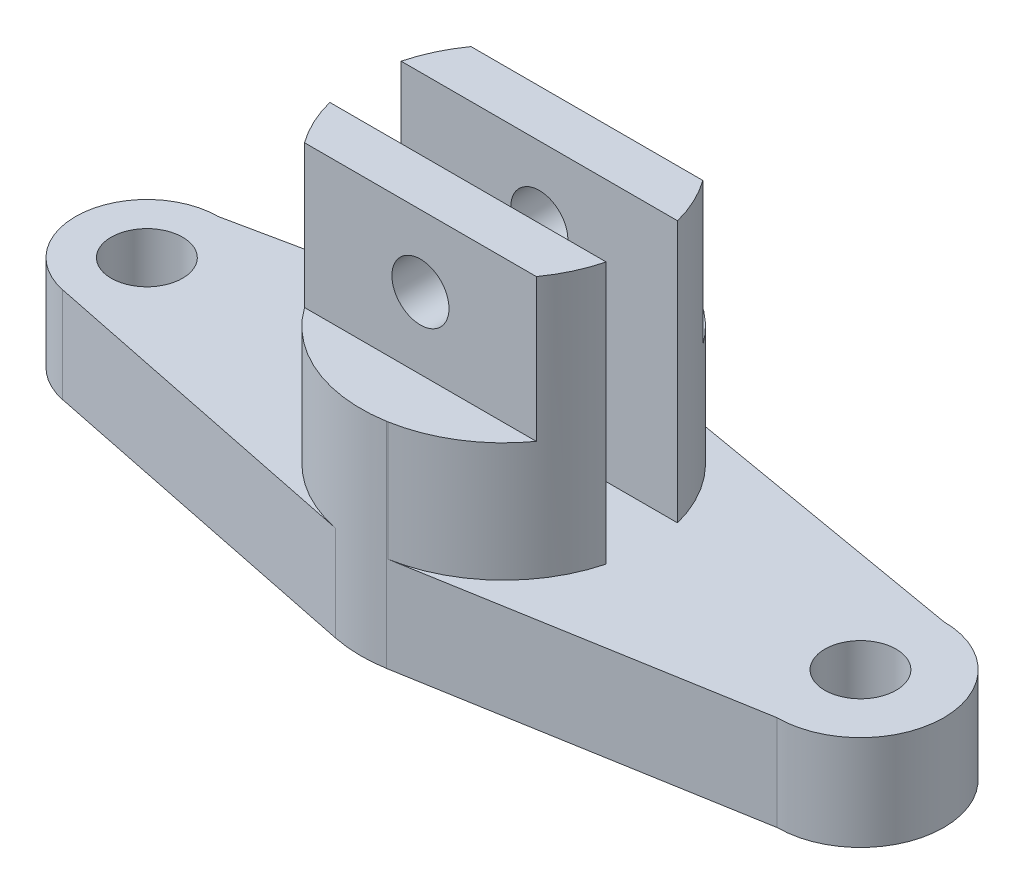
ISO-10303-21;
HEADER;
FILE_DESCRIPTION(('STEP AP214'),'2;1');
FILE_NAME('part.step','',(''),(''),'','','');
FILE_SCHEMA(('AUTOMOTIVE_DESIGN { 1 0 10303 214 1 1 1 1 }'));
ENDSEC;
DATA;
#1=APPLICATION_CONTEXT('core data for automotive mechanical design processes');
#2=APPLICATION_PROTOCOL_DEFINITION('international standard','automotive_design',2000,#1);
#3=PRODUCT_CONTEXT('',#1,'mechanical');
#4=PRODUCT('Part','Part','',(#3));
#5=PRODUCT_RELATED_PRODUCT_CATEGORY('part','',(#4));
#6=PRODUCT_DEFINITION_FORMATION('','',#4);
#7=PRODUCT_DEFINITION_CONTEXT('part definition',#1,'design');
#8=PRODUCT_DEFINITION('design','',#6,#7);
#9=PRODUCT_DEFINITION_SHAPE('','',#8);
#10=(LENGTH_UNIT() NAMED_UNIT(*) SI_UNIT(.MILLI.,.METRE.));
#11=(NAMED_UNIT(*) PLANE_ANGLE_UNIT() SI_UNIT($,.RADIAN.));
#12=(NAMED_UNIT(*) SI_UNIT($,.STERADIAN.) SOLID_ANGLE_UNIT());
#13=UNCERTAINTY_MEASURE_WITH_UNIT(LENGTH_MEASURE(1.E-05),#10,'distance_accuracy_value','');
#14=(GEOMETRIC_REPRESENTATION_CONTEXT(3) GLOBAL_UNCERTAINTY_ASSIGNED_CONTEXT((#13)) GLOBAL_UNIT_ASSIGNED_CONTEXT((#10,
#11,#12)) REPRESENTATION_CONTEXT('',''));
#15=CARTESIAN_POINT('',(0.,0.,0.));
#16=DIRECTION('',(0.,0.,1.));
#17=DIRECTION('',(1.,0.,0.));
#18=AXIS2_PLACEMENT_3D('',#15,#16,#17);
#19=CARTESIAN_POINT('',(0.,45.,0.));
#20=DIRECTION('',(0.,1.,0.));
#21=DIRECTION('',(0.,0.,1.));
#22=AXIS2_PLACEMENT_3D('',#19,#20,#21);
#23=PLANE('',#22);
#24=CARTESIAN_POINT('',(0.,45.,0.));
#25=DIRECTION('',(0.,1.,0.));
#26=DIRECTION('',(0.,0.,1.));
#27=AXIS2_PLACEMENT_3D('',#24,#25,#26);
#28=CIRCLE('',#27,30.);
#29=CARTESIAN_POINT('',(5.22334085747034,45.,29.5417790643468));
#30=VERTEX_POINT('',#29);
#31=CARTESIAN_POINT('',(24.3669858620224,45.,17.5));
#32=VERTEX_POINT('',#31);
#33=EDGE_CURVE('E246',#30,#32,#28,.T.);
#34=ORIENTED_EDGE('',*,*,#33,.T.);
#35=DIRECTION('',(-1.,0.,0.));
#36=VECTOR('',#35,1.);
#37=CARTESIAN_POINT('',(0.,45.,17.5));
#38=LINE('',#37,#36);
#39=CARTESIAN_POINT('',(-24.3669858620224,45.,17.5));
#40=VERTEX_POINT('',#39);
#41=EDGE_CURVE('E229',#32,#40,#38,.T.);
#42=ORIENTED_EDGE('',*,*,#41,.T.);
#43=CARTESIAN_POINT('',(0.,45.,0.));
#44=DIRECTION('',(0.,1.,0.));
#45=DIRECTION('',(0.,0.,1.));
#46=AXIS2_PLACEMENT_3D('',#43,#44,#45);
#47=CIRCLE('',#46,30.);
#48=CARTESIAN_POINT('',(4.9803035051641,45.,29.5837214865955));
#49=VERTEX_POINT('',#48);
#50=EDGE_CURVE('E250',#40,#49,#47,.T.);
#51=ORIENTED_EDGE('',*,*,#50,.T.);
#52=DIRECTION('',(0.985433334257071,0.,-0.170062176085665));
#53=VECTOR('',#52,1.);
#54=CARTESIAN_POINT('',(5.10182218131879,45.,29.5627502754709));
#55=LINE('',#54,#53);
#56=EDGE_CURVE('E254',#49,#30,#55,.T.);
#57=ORIENTED_EDGE('',*,*,#56,.T.);
#58=EDGE_LOOP('',(#34,#42,#51,#57));
#59=FACE_BOUND('',#58,.T.);
#60=ADVANCED_FACE('F47',(#59),#23,.T.);
#61=CARTESIAN_POINT('',(5.10182218131879,20.,-29.5627502754709));
#62=DIRECTION('',(-0.170062176085665,0.,0.985433334257071));
#63=DIRECTION('',(0.985433334257071,0.,0.170062176085665));
#64=AXIS2_PLACEMENT_3D('',#61,#62,#63);
#65=PLANE('',#64);
#66=DIRECTION('',(-0.985433334257071,0.,-0.170062176085665));
#67=VECTOR('',#66,1.);
#68=CARTESIAN_POINT('',(5.10182218131879,0.,-29.5627502754709));
#69=LINE('',#68,#67);
#70=CARTESIAN_POINT('',(75.,0.,-17.5));
#71=VERTEX_POINT('',#70);
#72=CARTESIAN_POINT('',(4.9803035051641,0.,-29.5837214865955));
#73=VERTEX_POINT('',#72);
#74=EDGE_CURVE('E280',#71,#73,#69,.T.);
#75=ORIENTED_EDGE('',*,*,#74,.T.);
#76=DIRECTION('',(0.,-1.,0.));
#77=VECTOR('',#76,1.);
#78=CARTESIAN_POINT('',(4.9803035051641,20.,-29.5837214865955));
#79=LINE('',#78,#77);
#80=CARTESIAN_POINT('',(4.98030350516411,45.,-29.5837214865955));
#81=VERTEX_POINT('',#80);
#82=EDGE_CURVE('E57',#81,#73,#79,.T.);
#83=ORIENTED_EDGE('',*,*,#82,.F.);
#84=DIRECTION('',(0.985433334257071,0.,0.170062176085665));
#85=VECTOR('',#84,1.);
#86=CARTESIAN_POINT('',(5.10182218131879,45.,-29.5627502754709));
#87=LINE('',#86,#85);
#88=CARTESIAN_POINT('',(5.22334085747207,45.,-29.5417790643465));
#89=VERTEX_POINT('',#88);
#90=EDGE_CURVE('E281',#81,#89,#87,.T.);
#91=ORIENTED_EDGE('',*,*,#90,.T.);
#92=DIRECTION('',(0.,-1.,0.));
#93=VECTOR('',#92,1.);
#94=CARTESIAN_POINT('',(5.22334085747207,45.,-29.5417790643465));
#95=LINE('',#94,#93);
#96=CARTESIAN_POINT('',(5.22334085747207,20.,-29.5417790643465));
#97=VERTEX_POINT('',#96);
#98=EDGE_CURVE('E189',#89,#97,#95,.T.);
#99=ORIENTED_EDGE('',*,*,#98,.T.);
#100=DIRECTION('',(-0.985433334257071,0.,-0.170062176085665));
#101=VECTOR('',#100,1.);
#102=CARTESIAN_POINT('',(5.10182218131879,20.,-29.5627502754709));
#103=LINE('',#102,#101);
#104=CARTESIAN_POINT('',(75.,20.,-17.5));
#105=VERTEX_POINT('',#104);
#106=EDGE_CURVE('E300',#105,#97,#103,.T.);
#107=ORIENTED_EDGE('',*,*,#106,.F.);
#108=DIRECTION('',(0.,-1.,0.));
#109=VECTOR('',#108,1.);
#110=CARTESIAN_POINT('',(75.,20.,-17.5));
#111=LINE('',#110,#109);
#112=EDGE_CURVE('E329',#105,#71,#111,.T.);
#113=ORIENTED_EDGE('',*,*,#112,.T.);
#114=EDGE_LOOP('',(#75,#83,#91,#99,#107,#113));
#115=FACE_BOUND('',#114,.T.);
#116=ADVANCED_FACE('F49',(#115),#65,.F.);
#117=CARTESIAN_POINT('',(0.,20.,0.));
#118=DIRECTION('',(0.,-1.,0.));
#119=DIRECTION('',(0.,0.,-1.));
#120=AXIS2_PLACEMENT_3D('',#117,#118,#119);
#121=CYLINDRICAL_SURFACE('',#120,30.);
#122=CARTESIAN_POINT('',(0.,0.,0.));
#123=DIRECTION('',(0.,1.,0.));
#124=DIRECTION('',(0.,0.,1.));
#125=AXIS2_PLACEMENT_3D('',#122,#123,#124);
#126=CIRCLE('',#125,30.);
#127=CARTESIAN_POINT('',(-6.12645394064298,0.,-29.3677810212685));
#128=VERTEX_POINT('',#127);
#129=EDGE_CURVE('E333',#73,#128,#126,.T.);
#130=ORIENTED_EDGE('',*,*,#129,.T.);
#131=DIRECTION('',(0.,-1.,0.));
#132=VECTOR('',#131,1.);
#133=CARTESIAN_POINT('',(-6.12645394064298,20.,-29.3677810212685));
#134=LINE('',#133,#132);
#135=CARTESIAN_POINT('',(-6.12645394064298,20.,-29.3677810212685));
#136=VERTEX_POINT('',#135);
#137=EDGE_CURVE('E385',#136,#128,#134,.T.);
#138=ORIENTED_EDGE('',*,*,#137,.F.);
#139=CARTESIAN_POINT('',(0.,20.,0.));
#140=DIRECTION('',(0.,1.,0.));
#141=DIRECTION('',(0.,0.,1.));
#142=AXIS2_PLACEMENT_3D('',#139,#140,#141);
#143=CIRCLE('',#142,30.);
#144=CARTESIAN_POINT('',(-29.0473750965556,20.,-7.50000000000001));
#145=VERTEX_POINT('',#144);
#146=EDGE_CURVE('E11',#136,#145,#143,.T.);
#147=ORIENTED_EDGE('',*,*,#146,.T.);
#148=DIRECTION('',(0.,-1.,0.));
#149=VECTOR('',#148,1.);
#150=CARTESIAN_POINT('',(-29.0473750965556,45.,-7.50000000000001));
#151=LINE('',#150,#149);
#152=CARTESIAN_POINT('',(-29.0473750965556,75.,-7.50000000000001));
#153=VERTEX_POINT('',#152);
#154=EDGE_CURVE('E188',#153,#145,#151,.T.);
#155=ORIENTED_EDGE('',*,*,#154,.F.);
#156=CARTESIAN_POINT('',(0.,75.,0.));
#157=DIRECTION('',(0.,1.,0.));
#158=DIRECTION('',(0.,0.,1.));
#159=AXIS2_PLACEMENT_3D('',#156,#157,#158);
#160=CIRCLE('',#159,30.);
#161=CARTESIAN_POINT('',(-24.3669858620224,75.,-17.5));
#162=VERTEX_POINT('',#161);
#163=EDGE_CURVE('E204',#162,#153,#160,.T.);
#164=ORIENTED_EDGE('',*,*,#163,.F.);
#165=DIRECTION('',(0.,-1.,0.));
#166=VECTOR('',#165,1.);
#167=CARTESIAN_POINT('',(-24.3669858620224,75.,-17.5));
#168=LINE('',#167,#166);
#169=CARTESIAN_POINT('',(-24.3669858620224,45.,-17.5));
#170=VERTEX_POINT('',#169);
#171=EDGE_CURVE('E217',#162,#170,#168,.T.);
#172=ORIENTED_EDGE('',*,*,#171,.T.);
#173=CARTESIAN_POINT('',(0.,45.,0.));
#174=DIRECTION('',(0.,1.,0.));
#175=DIRECTION('',(0.,0.,1.));
#176=AXIS2_PLACEMENT_3D('',#173,#174,#175);
#177=CIRCLE('',#176,30.);
#178=EDGE_CURVE('E288',#81,#170,#177,.T.);
#179=ORIENTED_EDGE('',*,*,#178,.F.);
#180=ORIENTED_EDGE('',*,*,#82,.T.);
#181=EDGE_LOOP('',(#130,#138,#147,#155,#164,#172,#179,#180));
#182=FACE_BOUND('',#181,.T.);
#183=ADVANCED_FACE('F391',(#182),#121,.T.);
#184=CARTESIAN_POINT('',(-6.12644335404868,20.,-29.3677832297488));
#185=DIRECTION('',(-0.204214778468303,0.,-0.978926107658358));
#186=DIRECTION('',(-0.978926107658358,0.,0.204214778468303));
#187=AXIS2_PLACEMENT_3D('',#184,#185,#186);
#188=PLANE('',#187);
#189=DIRECTION('',(0.978926107658358,0.,-0.204214778468303));
#190=VECTOR('',#189,1.);
#191=CARTESIAN_POINT('',(-6.12644335404868,0.,-29.3677832297488));
#192=LINE('',#191,#190);
#193=CARTESIAN_POINT('',(-75.,0.,-15.));
#194=VERTEX_POINT('',#193);
#195=EDGE_CURVE('E337',#194,#128,#192,.T.);
#196=ORIENTED_EDGE('',*,*,#195,.F.);
#197=DIRECTION('',(0.,-1.,0.));
#198=VECTOR('',#197,1.);
#199=CARTESIAN_POINT('',(-75.,20.,-15.));
#200=LINE('',#199,#198);
#201=CARTESIAN_POINT('',(-75.,20.,-15.));
#202=VERTEX_POINT('',#201);
#203=EDGE_CURVE('E382',#202,#194,#200,.T.);
#204=ORIENTED_EDGE('',*,*,#203,.F.);
#205=DIRECTION('',(0.978926107658358,0.,-0.204214778468303));
#206=VECTOR('',#205,1.);
#207=CARTESIAN_POINT('',(-6.12644335404868,20.,-29.3677832297488));
#208=LINE('',#207,#206);
#209=EDGE_CURVE('E303',#202,#136,#208,.T.);
#210=ORIENTED_EDGE('',*,*,#209,.T.);
#211=ORIENTED_EDGE('',*,*,#137,.T.);
#212=EDGE_LOOP('',(#196,#204,#210,#211));
#213=FACE_BOUND('',#212,.T.);
#214=ADVANCED_FACE('F407',(#213),#188,.T.);
#215=CARTESIAN_POINT('',(-75.,20.,0.));
#216=DIRECTION('',(0.,-1.,0.));
#217=DIRECTION('',(0.,0.,-1.));
#218=AXIS2_PLACEMENT_3D('',#215,#216,#217);
#219=CYLINDRICAL_SURFACE('',#218,15.);
#220=CARTESIAN_POINT('',(-75.,0.,0.));
#221=DIRECTION('',(0.,1.,0.));
#222=DIRECTION('',(0.,0.,1.));
#223=AXIS2_PLACEMENT_3D('',#220,#221,#222);
#224=CIRCLE('',#223,15.);
#225=CARTESIAN_POINT('',(-78.,0.,14.6969384566991));
#226=VERTEX_POINT('',#225);
#227=EDGE_CURVE('E341',#194,#226,#224,.T.);
#228=ORIENTED_EDGE('',*,*,#227,.T.);
#229=DIRECTION('',(0.,-1.,0.));
#230=VECTOR('',#229,1.);
#231=CARTESIAN_POINT('',(-78.,20.,14.6969384566991));
#232=LINE('',#231,#230);
#233=CARTESIAN_POINT('',(-78.,20.,14.6969384566991));
#234=VERTEX_POINT('',#233);
#235=EDGE_CURVE('E378',#234,#226,#232,.T.);
#236=ORIENTED_EDGE('',*,*,#235,.F.);
#237=CARTESIAN_POINT('',(-75.,20.,0.));
#238=DIRECTION('',(0.,1.,0.));
#239=DIRECTION('',(0.,0.,1.));
#240=AXIS2_PLACEMENT_3D('',#237,#238,#239);
#241=CIRCLE('',#240,15.);
#242=EDGE_CURVE('E308',#202,#234,#241,.T.);
#243=ORIENTED_EDGE('',*,*,#242,.F.);
#244=ORIENTED_EDGE('',*,*,#203,.T.);
#245=EDGE_LOOP('',(#228,#236,#243,#244));
#246=FACE_BOUND('',#245,.T.);
#247=ADVANCED_FACE('F485',(#246),#219,.T.);
#248=CARTESIAN_POINT('',(-5.99999999999999,20.,29.3938769133981));
#249=DIRECTION('',(0.2,0.,-0.979795897113271));
#250=DIRECTION('',(-0.979795897113271,0.,-0.2));
#251=AXIS2_PLACEMENT_3D('',#248,#249,#250);
#252=PLANE('',#251);
#253=DIRECTION('',(0.979795897113271,0.,0.2));
#254=VECTOR('',#253,1.);
#255=CARTESIAN_POINT('',(-5.99999999999999,0.,29.3938769133981));
#256=LINE('',#255,#254);
#257=CARTESIAN_POINT('',(-6.,0.,29.3938769133981));
#258=VERTEX_POINT('',#257);
#259=EDGE_CURVE('E344',#226,#258,#256,.T.);
#260=ORIENTED_EDGE('',*,*,#259,.T.);
#261=DIRECTION('',(0.,-1.,0.));
#262=VECTOR('',#261,1.);
#263=CARTESIAN_POINT('',(-6.,20.,29.3938769133981));
#264=LINE('',#263,#262);
#265=CARTESIAN_POINT('',(-6.,20.,29.3938769133981));
#266=VERTEX_POINT('',#265);
#267=EDGE_CURVE('E374',#266,#258,#264,.T.);
#268=ORIENTED_EDGE('',*,*,#267,.F.);
#269=DIRECTION('',(0.979795897113271,0.,0.2));
#270=VECTOR('',#269,1.);
#271=CARTESIAN_POINT('',(-5.99999999999999,20.,29.3938769133981));
#272=LINE('',#271,#270);
#273=EDGE_CURVE('E311',#234,#266,#272,.T.);
#274=ORIENTED_EDGE('',*,*,#273,.F.);
#275=ORIENTED_EDGE('',*,*,#235,.T.);
#276=EDGE_LOOP('',(#260,#268,#274,#275));
#277=FACE_BOUND('',#276,.T.);
#278=ADVANCED_FACE('F481',(#277),#252,.F.);
#279=CARTESIAN_POINT('',(0.,20.,0.));
#280=DIRECTION('',(0.,-1.,0.));
#281=DIRECTION('',(0.,0.,-1.));
#282=AXIS2_PLACEMENT_3D('',#279,#280,#281);
#283=CYLINDRICAL_SURFACE('',#282,30.);
#284=CARTESIAN_POINT('',(0.,0.,0.));
#285=DIRECTION('',(0.,1.,0.));
#286=DIRECTION('',(0.,0.,1.));
#287=AXIS2_PLACEMENT_3D('',#284,#285,#286);
#288=CIRCLE('',#287,30.);
#289=CARTESIAN_POINT('',(4.9803035051641,0.,29.5837214865955));
#290=VERTEX_POINT('',#289);
#291=EDGE_CURVE('E347',#258,#290,#288,.T.);
#292=ORIENTED_EDGE('',*,*,#291,.T.);
#293=DIRECTION('',(0.,-1.,0.));
#294=VECTOR('',#293,1.);
#295=CARTESIAN_POINT('',(4.9803035051641,20.,29.5837214865955));
#296=LINE('',#295,#294);
#297=EDGE_CURVE('E371',#49,#290,#296,.T.);
#298=ORIENTED_EDGE('',*,*,#297,.F.);
#299=ORIENTED_EDGE('',*,*,#50,.F.);
#300=DIRECTION('',(0.,-1.,0.));
#301=VECTOR('',#300,1.);
#302=CARTESIAN_POINT('',(-24.3669858620224,75.,17.5));
#303=LINE('',#302,#301);
#304=CARTESIAN_POINT('',(-24.3669858620224,75.,17.5));
#305=VERTEX_POINT('',#304);
#306=EDGE_CURVE('E73',#305,#40,#303,.T.);
#307=ORIENTED_EDGE('',*,*,#306,.F.);
#308=CARTESIAN_POINT('',(0.,75.,0.));
#309=DIRECTION('',(0.,1.,0.));
#310=DIRECTION('',(0.,0.,1.));
#311=AXIS2_PLACEMENT_3D('',#308,#309,#310);
#312=CIRCLE('',#311,30.);
#313=CARTESIAN_POINT('',(-29.0473750965556,75.,7.5));
#314=VERTEX_POINT('',#313);
#315=EDGE_CURVE('E228',#314,#305,#312,.T.);
#316=ORIENTED_EDGE('',*,*,#315,.F.);
#317=DIRECTION('',(0.,-1.,0.));
#318=VECTOR('',#317,1.);
#319=CARTESIAN_POINT('',(-29.0473750965556,45.,7.5));
#320=LINE('',#319,#318);
#321=CARTESIAN_POINT('',(-29.0473750965556,20.,7.5));
#322=VERTEX_POINT('',#321);
#323=EDGE_CURVE('E272',#314,#322,#320,.T.);
#324=ORIENTED_EDGE('',*,*,#323,.T.);
#325=CARTESIAN_POINT('',(0.,20.,0.));
#326=DIRECTION('',(0.,1.,0.));
#327=DIRECTION('',(0.,0.,1.));
#328=AXIS2_PLACEMENT_3D('',#325,#326,#327);
#329=CIRCLE('',#328,30.);
#330=EDGE_CURVE('E251',#322,#266,#329,.T.);
#331=ORIENTED_EDGE('',*,*,#330,.T.);
#332=ORIENTED_EDGE('',*,*,#267,.T.);
#333=EDGE_LOOP('',(#292,#298,#299,#307,#316,#324,#331,#332));
#334=FACE_BOUND('',#333,.T.);
#335=ADVANCED_FACE('F477',(#334),#283,.T.);
#336=CARTESIAN_POINT('',(5.10182218131879,20.,29.5627502754709));
#337=DIRECTION('',(0.170062176085665,0.,0.985433334257071));
#338=DIRECTION('',(0.985433334257071,0.,-0.170062176085665));
#339=AXIS2_PLACEMENT_3D('',#336,#337,#338);
#340=PLANE('',#339);
#341=DIRECTION('',(-0.985433334257071,0.,0.170062176085665));
#342=VECTOR('',#341,1.);
#343=CARTESIAN_POINT('',(5.10182218131879,0.,29.5627502754709));
#344=LINE('',#343,#342);
#345=CARTESIAN_POINT('',(75.,0.,17.5));
#346=VERTEX_POINT('',#345);
#347=EDGE_CURVE('E351',#346,#290,#344,.T.);
#348=ORIENTED_EDGE('',*,*,#347,.F.);
#349=DIRECTION('',(0.,-1.,0.));
#350=VECTOR('',#349,1.);
#351=CARTESIAN_POINT('',(75.,20.,17.5));
#352=LINE('',#351,#350);
#353=CARTESIAN_POINT('',(75.,20.,17.5));
#354=VERTEX_POINT('',#353);
#355=EDGE_CURVE('E368',#354,#346,#352,.T.);
#356=ORIENTED_EDGE('',*,*,#355,.F.);
#357=DIRECTION('',(-0.985433334257071,0.,0.170062176085665));
#358=VECTOR('',#357,1.);
#359=CARTESIAN_POINT('',(5.10182218131879,20.,29.5627502754709));
#360=LINE('',#359,#358);
#361=CARTESIAN_POINT('',(5.22334085747034,20.,29.5417790643468));
#362=VERTEX_POINT('',#361);
#363=EDGE_CURVE('E314',#354,#362,#360,.T.);
#364=ORIENTED_EDGE('',*,*,#363,.T.);
#365=DIRECTION('',(0.,-1.,0.));
#366=VECTOR('',#365,1.);
#367=CARTESIAN_POINT('',(5.22334085747034,45.,29.5417790643468));
#368=LINE('',#367,#366);
#369=EDGE_CURVE('E257',#30,#362,#368,.T.);
#370=ORIENTED_EDGE('',*,*,#369,.F.);
#371=ORIENTED_EDGE('',*,*,#56,.F.);
#372=ORIENTED_EDGE('',*,*,#297,.T.);
#373=EDGE_LOOP('',(#348,#356,#364,#370,#371,#372));
#374=FACE_BOUND('',#373,.T.);
#375=ADVANCED_FACE('F470',(#374),#340,.T.);
#376=CARTESIAN_POINT('',(-75.,20.,0.));
#377=DIRECTION('',(0.,-1.,0.));
#378=DIRECTION('',(0.,0.,-1.));
#379=AXIS2_PLACEMENT_3D('',#376,#377,#378);
#380=CYLINDRICAL_SURFACE('',#379,7.5);
#381=CARTESIAN_POINT('',(-75.,20.,0.));
#382=DIRECTION('',(0.,1.,0.));
#383=DIRECTION('',(0.,0.,1.));
#384=AXIS2_PLACEMENT_3D('',#381,#382,#383);
#385=CIRCLE('',#384,7.5);
#386=CARTESIAN_POINT('',(-75.,20.,7.50000000000001));
#387=VERTEX_POINT('',#386);
#388=EDGE_CURVE('E321',#387,#387,#385,.T.);
#389=ORIENTED_EDGE('',*,*,#388,.T.);
#390=EDGE_LOOP('',(#389));
#391=FACE_BOUND('',#390,.T.);
#392=CARTESIAN_POINT('',(-75.,0.,0.));
#393=DIRECTION('',(0.,1.,0.));
#394=DIRECTION('',(0.,0.,1.));
#395=AXIS2_PLACEMENT_3D('',#392,#393,#394);
#396=CIRCLE('',#395,7.5);
#397=CARTESIAN_POINT('',(-75.,0.,7.50000000000001));
#398=VERTEX_POINT('',#397);
#399=EDGE_CURVE('E358',#398,#398,#396,.T.);
#400=ORIENTED_EDGE('',*,*,#399,.F.);
#401=EDGE_LOOP('',(#400));
#402=FACE_BOUND('',#401,.T.);
#403=ADVANCED_FACE('F467',(#391,#402),#380,.F.);
#404=CARTESIAN_POINT('',(75.,20.,0.));
#405=DIRECTION('',(0.,-1.,0.));
#406=DIRECTION('',(0.,0.,-1.));
#407=AXIS2_PLACEMENT_3D('',#404,#405,#406);
#408=CYLINDRICAL_SURFACE('',#407,17.5);
#409=CARTESIAN_POINT('',(75.,0.,0.));
#410=DIRECTION('',(0.,1.,0.));
#411=DIRECTION('',(0.,0.,1.));
#412=AXIS2_PLACEMENT_3D('',#409,#410,#411);
#413=CIRCLE('',#412,17.5);
#414=EDGE_CURVE('E355',#346,#71,#413,.T.);
#415=ORIENTED_EDGE('',*,*,#414,.T.);
#416=ORIENTED_EDGE('',*,*,#112,.F.);
#417=CARTESIAN_POINT('',(75.,20.,0.));
#418=DIRECTION('',(0.,1.,0.));
#419=DIRECTION('',(0.,0.,1.));
#420=AXIS2_PLACEMENT_3D('',#417,#418,#419);
#421=CIRCLE('',#420,17.5);
#422=EDGE_CURVE('E318',#354,#105,#421,.T.);
#423=ORIENTED_EDGE('',*,*,#422,.F.);
#424=ORIENTED_EDGE('',*,*,#355,.T.);
#425=EDGE_LOOP('',(#415,#416,#423,#424));
#426=FACE_BOUND('',#425,.T.);
#427=ADVANCED_FACE('F465',(#426),#408,.T.);
#428=CARTESIAN_POINT('',(75.,20.,0.));
#429=DIRECTION('',(0.,-1.,0.));
#430=DIRECTION('',(0.,0.,-1.));
#431=AXIS2_PLACEMENT_3D('',#428,#429,#430);
#432=CYLINDRICAL_SURFACE('',#431,7.5);
#433=CARTESIAN_POINT('',(75.,20.,0.));
#434=DIRECTION('',(0.,1.,0.));
#435=DIRECTION('',(0.,0.,1.));
#436=AXIS2_PLACEMENT_3D('',#433,#434,#435);
#437=CIRCLE('',#436,7.5);
#438=CARTESIAN_POINT('',(75.,20.,7.5));
#439=VERTEX_POINT('',#438);
#440=EDGE_CURVE('E325',#439,#439,#437,.T.);
#441=ORIENTED_EDGE('',*,*,#440,.T.);
#442=EDGE_LOOP('',(#441));
#443=FACE_BOUND('',#442,.T.);
#444=CARTESIAN_POINT('',(75.,0.,0.));
#445=DIRECTION('',(0.,1.,0.));
#446=DIRECTION('',(0.,0.,1.));
#447=AXIS2_PLACEMENT_3D('',#444,#445,#446);
#448=CIRCLE('',#447,7.5);
#449=CARTESIAN_POINT('',(75.,0.,7.5));
#450=VERTEX_POINT('',#449);
#451=EDGE_CURVE('E304',#450,#450,#448,.T.);
#452=ORIENTED_EDGE('',*,*,#451,.F.);
#453=EDGE_LOOP('',(#452));
#454=FACE_BOUND('',#453,.T.);
#455=ADVANCED_FACE('F460',(#443,#454),#432,.F.);
#456=CARTESIAN_POINT('',(0.,20.,0.));
#457=DIRECTION('',(0.,1.,0.));
#458=DIRECTION('',(0.,0.,1.));
#459=AXIS2_PLACEMENT_3D('',#456,#457,#458);
#460=PLANE('',#459);
#461=CARTESIAN_POINT('',(0.,20.,0.));
#462=DIRECTION('',(0.,1.,0.));
#463=DIRECTION('',(0.,0.,1.));
#464=AXIS2_PLACEMENT_3D('',#461,#462,#463);
#465=CIRCLE('',#464,30.);
#466=CARTESIAN_POINT('',(29.0473750965556,20.,7.49999999999999));
#467=VERTEX_POINT('',#466);
#468=EDGE_CURVE('E258',#362,#467,#465,.T.);
#469=ORIENTED_EDGE('',*,*,#468,.F.);
#470=ORIENTED_EDGE('',*,*,#363,.F.);
#471=ORIENTED_EDGE('',*,*,#422,.T.);
#472=ORIENTED_EDGE('',*,*,#106,.T.);
#473=CARTESIAN_POINT('',(0.,20.,0.));
#474=DIRECTION('',(0.,1.,0.));
#475=DIRECTION('',(0.,0.,1.));
#476=AXIS2_PLACEMENT_3D('',#473,#474,#475);
#477=CIRCLE('',#476,30.);
#478=CARTESIAN_POINT('',(29.0473750965556,20.,-7.5));
#479=VERTEX_POINT('',#478);
#480=EDGE_CURVE('E224',#479,#97,#477,.T.);
#481=ORIENTED_EDGE('',*,*,#480,.F.);
#482=DIRECTION('',(1.,0.,0.));
#483=VECTOR('',#482,1.);
#484=CARTESIAN_POINT('',(0.,20.,-7.5));
#485=LINE('',#484,#483);
#486=EDGE_CURVE('E184',#145,#479,#485,.T.);
#487=ORIENTED_EDGE('',*,*,#486,.F.);
#488=ORIENTED_EDGE('',*,*,#146,.F.);
#489=ORIENTED_EDGE('',*,*,#209,.F.);
#490=ORIENTED_EDGE('',*,*,#242,.T.);
#491=ORIENTED_EDGE('',*,*,#273,.T.);
#492=ORIENTED_EDGE('',*,*,#330,.F.);
#493=DIRECTION('',(-1.,0.,0.));
#494=VECTOR('',#493,1.);
#495=CARTESIAN_POINT('',(0.,20.,7.5));
#496=LINE('',#495,#494);
#497=EDGE_CURVE('E262',#467,#322,#496,.T.);
#498=ORIENTED_EDGE('',*,*,#497,.F.);
#499=EDGE_LOOP('',(#469,#470,#471,#472,#481,#487,#488,#489,#490,#491,#492,#498));
#500=FACE_BOUND('',#499,.T.);
#501=ORIENTED_EDGE('',*,*,#388,.F.);
#502=EDGE_LOOP('',(#501));
#503=FACE_BOUND('',#502,.T.);
#504=ORIENTED_EDGE('',*,*,#440,.F.);
#505=EDGE_LOOP('',(#504));
#506=FACE_BOUND('',#505,.T.);
#507=ADVANCED_FACE('F411',(#500,#503,#506),#460,.T.);
#508=CARTESIAN_POINT('',(0.,0.,0.));
#509=DIRECTION('',(0.,1.,0.));
#510=DIRECTION('',(0.,0.,1.));
#511=AXIS2_PLACEMENT_3D('',#508,#509,#510);
#512=PLANE('',#511);
#513=ORIENTED_EDGE('',*,*,#74,.F.);
#514=ORIENTED_EDGE('',*,*,#414,.F.);
#515=ORIENTED_EDGE('',*,*,#347,.T.);
#516=ORIENTED_EDGE('',*,*,#291,.F.);
#517=ORIENTED_EDGE('',*,*,#259,.F.);
#518=ORIENTED_EDGE('',*,*,#227,.F.);
#519=ORIENTED_EDGE('',*,*,#195,.T.);
#520=ORIENTED_EDGE('',*,*,#129,.F.);
#521=EDGE_LOOP('',(#513,#514,#515,#516,#517,#518,#519,#520));
#522=FACE_BOUND('',#521,.T.);
#523=ORIENTED_EDGE('',*,*,#399,.T.);
#524=EDGE_LOOP('',(#523));
#525=FACE_BOUND('',#524,.T.);
#526=ORIENTED_EDGE('',*,*,#451,.T.);
#527=EDGE_LOOP('',(#526));
#528=FACE_BOUND('',#527,.T.);
#529=ADVANCED_FACE('F400',(#522,#525,#528),#512,.F.);
#530=CARTESIAN_POINT('',(0.,45.,-7.5));
#531=DIRECTION('',(0.,0.,-1.));
#532=DIRECTION('',(-1.,0.,0.));
#533=AXIS2_PLACEMENT_3D('',#530,#531,#532);
#534=PLANE('',#533);
#535=CARTESIAN_POINT('',(0.,60.,-7.5));
#536=DIRECTION('',(0.,0.,-1.));
#537=DIRECTION('',(-1.,0.,0.));
#538=AXIS2_PLACEMENT_3D('',#535,#536,#537);
#539=CIRCLE('',#538,6.);
#540=CARTESIAN_POINT('',(-6.,60.,-7.5));
#541=VERTEX_POINT('',#540);
#542=EDGE_CURVE('E211',#541,#541,#539,.T.);
#543=ORIENTED_EDGE('',*,*,#542,.T.);
#544=EDGE_LOOP('',(#543));
#545=FACE_BOUND('',#544,.T.);
#546=ORIENTED_EDGE('',*,*,#486,.T.);
#547=DIRECTION('',(0.,-1.,0.));
#548=VECTOR('',#547,1.);
#549=CARTESIAN_POINT('',(29.0473750965556,45.,-7.5));
#550=LINE('',#549,#548);
#551=CARTESIAN_POINT('',(29.0473750965556,75.,-7.5));
#552=VERTEX_POINT('',#551);
#553=EDGE_CURVE('E178',#552,#479,#550,.T.);
#554=ORIENTED_EDGE('',*,*,#553,.F.);
#555=DIRECTION('',(1.,0.,0.));
#556=VECTOR('',#555,1.);
#557=CARTESIAN_POINT('',(0.,75.,-7.5));
#558=LINE('',#557,#556);
#559=EDGE_CURVE('E183',#153,#552,#558,.T.);
#560=ORIENTED_EDGE('',*,*,#559,.F.);
#561=ORIENTED_EDGE('',*,*,#154,.T.);
#562=EDGE_LOOP('',(#546,#554,#560,#561));
#563=FACE_BOUND('',#562,.T.);
#564=ADVANCED_FACE('F180',(#545,#563),#534,.F.);
#565=CARTESIAN_POINT('',(0.,45.,0.));
#566=DIRECTION('',(0.,-1.,0.));
#567=DIRECTION('',(0.,0.,-1.));
#568=AXIS2_PLACEMENT_3D('',#565,#566,#567);
#569=CYLINDRICAL_SURFACE('',#568,30.);
#570=ORIENTED_EDGE('',*,*,#480,.T.);
#571=ORIENTED_EDGE('',*,*,#98,.F.);
#572=CARTESIAN_POINT('',(0.,45.,0.));
#573=DIRECTION('',(0.,1.,0.));
#574=DIRECTION('',(0.,0.,1.));
#575=AXIS2_PLACEMENT_3D('',#572,#573,#574);
#576=CIRCLE('',#575,30.);
#577=CARTESIAN_POINT('',(24.3669858620224,45.,-17.5));
#578=VERTEX_POINT('',#577);
#579=EDGE_CURVE('E285',#578,#89,#576,.T.);
#580=ORIENTED_EDGE('',*,*,#579,.F.);
#581=DIRECTION('',(0.,-1.,0.));
#582=VECTOR('',#581,1.);
#583=CARTESIAN_POINT('',(24.3669858620224,75.,-17.5));
#584=LINE('',#583,#582);
#585=CARTESIAN_POINT('',(24.3669858620224,75.,-17.5));
#586=VERTEX_POINT('',#585);
#587=EDGE_CURVE('E195',#586,#578,#584,.T.);
#588=ORIENTED_EDGE('',*,*,#587,.F.);
#589=CARTESIAN_POINT('',(0.,75.,0.));
#590=DIRECTION('',(0.,1.,0.));
#591=DIRECTION('',(0.,0.,1.));
#592=AXIS2_PLACEMENT_3D('',#589,#590,#591);
#593=CIRCLE('',#592,30.);
#594=EDGE_CURVE('E192',#552,#586,#593,.T.);
#595=ORIENTED_EDGE('',*,*,#594,.F.);
#596=ORIENTED_EDGE('',*,*,#553,.T.);
#597=EDGE_LOOP('',(#570,#571,#580,#588,#595,#596));
#598=FACE_BOUND('',#597,.T.);
#599=ADVANCED_FACE('F193',(#598),#569,.T.);
#600=CARTESIAN_POINT('',(0.,45.,0.));
#601=DIRECTION('',(0.,1.,0.));
#602=DIRECTION('',(0.,0.,1.));
#603=AXIS2_PLACEMENT_3D('',#600,#601,#602);
#604=PLANE('',#603);
#605=DIRECTION('',(-1.,0.,0.));
#606=VECTOR('',#605,1.);
#607=CARTESIAN_POINT('',(0.,45.,-17.5));
#608=LINE('',#607,#606);
#609=EDGE_CURVE('E65',#578,#170,#608,.T.);
#610=ORIENTED_EDGE('',*,*,#609,.F.);
#611=ORIENTED_EDGE('',*,*,#579,.T.);
#612=ORIENTED_EDGE('',*,*,#90,.F.);
#613=ORIENTED_EDGE('',*,*,#178,.T.);
#614=EDGE_LOOP('',(#610,#611,#612,#613));
#615=FACE_BOUND('',#614,.T.);
#616=ADVANCED_FACE('F414',(#615),#604,.T.);
#617=CARTESIAN_POINT('',(0.,45.,0.));
#618=DIRECTION('',(0.,-1.,0.));
#619=DIRECTION('',(0.,0.,-1.));
#620=AXIS2_PLACEMENT_3D('',#617,#618,#619);
#621=CYLINDRICAL_SURFACE('',#620,30.);
#622=ORIENTED_EDGE('',*,*,#468,.T.);
#623=DIRECTION('',(0.,-1.,0.));
#624=VECTOR('',#623,1.);
#625=CARTESIAN_POINT('',(29.0473750965556,45.,7.49999999999999));
#626=LINE('',#625,#624);
#627=CARTESIAN_POINT('',(29.0473750965556,75.,7.49999999999999));
#628=VERTEX_POINT('',#627);
#629=EDGE_CURVE('E276',#628,#467,#626,.T.);
#630=ORIENTED_EDGE('',*,*,#629,.F.);
#631=CARTESIAN_POINT('',(0.,75.,0.));
#632=DIRECTION('',(0.,1.,0.));
#633=DIRECTION('',(0.,0.,1.));
#634=AXIS2_PLACEMENT_3D('',#631,#632,#633);
#635=CIRCLE('',#634,30.);
#636=CARTESIAN_POINT('',(24.3669858620224,75.,17.5));
#637=VERTEX_POINT('',#636);
#638=EDGE_CURVE('E236',#637,#628,#635,.T.);
#639=ORIENTED_EDGE('',*,*,#638,.F.);
#640=DIRECTION('',(0.,-1.,0.));
#641=VECTOR('',#640,1.);
#642=CARTESIAN_POINT('',(24.3669858620224,75.,17.5));
#643=LINE('',#642,#641);
#644=EDGE_CURVE('E208',#637,#32,#643,.T.);
#645=ORIENTED_EDGE('',*,*,#644,.T.);
#646=ORIENTED_EDGE('',*,*,#33,.F.);
#647=ORIENTED_EDGE('',*,*,#369,.T.);
#648=EDGE_LOOP('',(#622,#630,#639,#645,#646,#647));
#649=FACE_BOUND('',#648,.T.);
#650=ADVANCED_FACE('F447',(#649),#621,.T.);
#651=CARTESIAN_POINT('',(0.,45.,7.5));
#652=DIRECTION('',(0.,0.,1.));
#653=DIRECTION('',(1.,0.,0.));
#654=AXIS2_PLACEMENT_3D('',#651,#652,#653);
#655=PLANE('',#654);
#656=CARTESIAN_POINT('',(0.,60.,7.49999999999999));
#657=DIRECTION('',(0.,0.,1.));
#658=DIRECTION('',(1.,0.,0.));
#659=AXIS2_PLACEMENT_3D('',#656,#657,#658);
#660=CIRCLE('',#659,6.);
#661=CARTESIAN_POINT('',(6.,60.,7.49999999999999));
#662=VERTEX_POINT('',#661);
#663=EDGE_CURVE('E575',#662,#662,#660,.T.);
#664=ORIENTED_EDGE('',*,*,#663,.T.);
#665=EDGE_LOOP('',(#664));
#666=FACE_BOUND('',#665,.T.);
#667=ORIENTED_EDGE('',*,*,#497,.T.);
#668=ORIENTED_EDGE('',*,*,#323,.F.);
#669=DIRECTION('',(-1.,0.,0.));
#670=VECTOR('',#669,1.);
#671=CARTESIAN_POINT('',(0.,75.,7.5));
#672=LINE('',#671,#670);
#673=EDGE_CURVE('E232',#628,#314,#672,.T.);
#674=ORIENTED_EDGE('',*,*,#673,.F.);
#675=ORIENTED_EDGE('',*,*,#629,.T.);
#676=EDGE_LOOP('',(#667,#668,#674,#675));
#677=FACE_BOUND('',#676,.T.);
#678=ADVANCED_FACE('F444',(#666,#677),#655,.F.);
#679=CARTESIAN_POINT('',(0.,75.,17.5));
#680=DIRECTION('',(0.,0.,1.));
#681=DIRECTION('',(1.,0.,0.));
#682=AXIS2_PLACEMENT_3D('',#679,#680,#681);
#683=PLANE('',#682);
#684=CARTESIAN_POINT('',(0.,60.,17.5));
#685=DIRECTION('',(0.,0.,1.));
#686=DIRECTION('',(1.,0.,0.));
#687=AXIS2_PLACEMENT_3D('',#684,#685,#686);
#688=CIRCLE('',#687,6.);
#689=CARTESIAN_POINT('',(6.,60.,17.5));
#690=VERTEX_POINT('',#689);
#691=EDGE_CURVE('E572',#690,#690,#688,.T.);
#692=ORIENTED_EDGE('',*,*,#691,.F.);
#693=EDGE_LOOP('',(#692));
#694=FACE_BOUND('',#693,.T.);
#695=ORIENTED_EDGE('',*,*,#41,.F.);
#696=ORIENTED_EDGE('',*,*,#644,.F.);
#697=DIRECTION('',(-1.,0.,0.));
#698=VECTOR('',#697,1.);
#699=CARTESIAN_POINT('',(0.,75.,17.5));
#700=LINE('',#699,#698);
#701=EDGE_CURVE('E225',#637,#305,#700,.T.);
#702=ORIENTED_EDGE('',*,*,#701,.T.);
#703=ORIENTED_EDGE('',*,*,#306,.T.);
#704=EDGE_LOOP('',(#695,#696,#702,#703));
#705=FACE_BOUND('',#704,.T.);
#706=ADVANCED_FACE('F430',(#694,#705),#683,.T.);
#707=CARTESIAN_POINT('',(0.,75.,0.));
#708=DIRECTION('',(0.,1.,0.));
#709=DIRECTION('',(0.,0.,1.));
#710=AXIS2_PLACEMENT_3D('',#707,#708,#709);
#711=PLANE('',#710);
#712=ORIENTED_EDGE('',*,*,#701,.F.);
#713=ORIENTED_EDGE('',*,*,#638,.T.);
#714=ORIENTED_EDGE('',*,*,#673,.T.);
#715=ORIENTED_EDGE('',*,*,#315,.T.);
#716=EDGE_LOOP('',(#712,#713,#714,#715));
#717=FACE_BOUND('',#716,.T.);
#718=ADVANCED_FACE('F419',(#717),#711,.T.);
#719=CARTESIAN_POINT('',(0.,75.,-17.5));
#720=DIRECTION('',(0.,0.,1.));
#721=DIRECTION('',(1.,0.,0.));
#722=AXIS2_PLACEMENT_3D('',#719,#720,#721);
#723=PLANE('',#722);
#724=CARTESIAN_POINT('',(0.,60.,-17.5));
#725=DIRECTION('',(0.,0.,1.));
#726=DIRECTION('',(1.,0.,0.));
#727=AXIS2_PLACEMENT_3D('',#724,#725,#726);
#728=CIRCLE('',#727,6.);
#729=CARTESIAN_POINT('',(6.,60.,-17.5));
#730=VERTEX_POINT('',#729);
#731=EDGE_CURVE('E51',#730,#730,#728,.T.);
#732=ORIENTED_EDGE('',*,*,#731,.T.);
#733=EDGE_LOOP('',(#732));
#734=FACE_BOUND('',#733,.T.);
#735=ORIENTED_EDGE('',*,*,#609,.T.);
#736=ORIENTED_EDGE('',*,*,#171,.F.);
#737=DIRECTION('',(-1.,0.,0.));
#738=VECTOR('',#737,1.);
#739=CARTESIAN_POINT('',(0.,75.,-17.5));
#740=LINE('',#739,#738);
#741=EDGE_CURVE('E199',#586,#162,#740,.T.);
#742=ORIENTED_EDGE('',*,*,#741,.F.);
#743=ORIENTED_EDGE('',*,*,#587,.T.);
#744=EDGE_LOOP('',(#735,#736,#742,#743));
#745=FACE_BOUND('',#744,.T.);
#746=ADVANCED_FACE('F417',(#734,#745),#723,.F.);
#747=CARTESIAN_POINT('',(0.,75.,0.));
#748=DIRECTION('',(0.,1.,0.));
#749=DIRECTION('',(0.,0.,1.));
#750=AXIS2_PLACEMENT_3D('',#747,#748,#749);
#751=PLANE('',#750);
#752=ORIENTED_EDGE('',*,*,#559,.T.);
#753=ORIENTED_EDGE('',*,*,#594,.T.);
#754=ORIENTED_EDGE('',*,*,#741,.T.);
#755=ORIENTED_EDGE('',*,*,#163,.T.);
#756=EDGE_LOOP('',(#752,#753,#754,#755));
#757=FACE_BOUND('',#756,.T.);
#758=ADVANCED_FACE('F202',(#757),#751,.T.);
#759=CARTESIAN_POINT('',(0.,60.,-30.));
#760=DIRECTION('',(0.,0.,1.));
#761=DIRECTION('',(1.,0.,0.));
#762=AXIS2_PLACEMENT_3D('',#759,#760,#761);
#763=CYLINDRICAL_SURFACE('',#762,6.);
#764=ORIENTED_EDGE('',*,*,#731,.F.);
#765=EDGE_LOOP('',(#764));
#766=FACE_BOUND('',#765,.T.);
#767=ORIENTED_EDGE('',*,*,#542,.F.);
#768=EDGE_LOOP('',(#767));
#769=FACE_BOUND('',#768,.T.);
#770=ADVANCED_FACE('F427',(#766,#769),#763,.F.);
#771=ORIENTED_EDGE('',*,*,#691,.T.);
#772=EDGE_LOOP('',(#771));
#773=FACE_BOUND('',#772,.T.);
#774=ORIENTED_EDGE('',*,*,#663,.F.);
#775=EDGE_LOOP('',(#774));
#776=FACE_BOUND('',#775,.T.);
#777=ADVANCED_FACE('F556',(#773,#776),#763,.F.);
#778=CLOSED_SHELL('',(#60,#116,#183,#214,#247,#278,#335,#375,#403,#427,#455,#507,#529,#564,#599,
#616,#650,#678,#706,#718,#746,#758,#770,#777));
#779=MANIFOLD_SOLID_BREP('B2',#778);
#780=ADVANCED_BREP_SHAPE_REPRESENTATION('',(#18,#779),#14);
#781=SHAPE_DEFINITION_REPRESENTATION(#9,#780);
ENDSEC;
END-ISO-10303-21;
